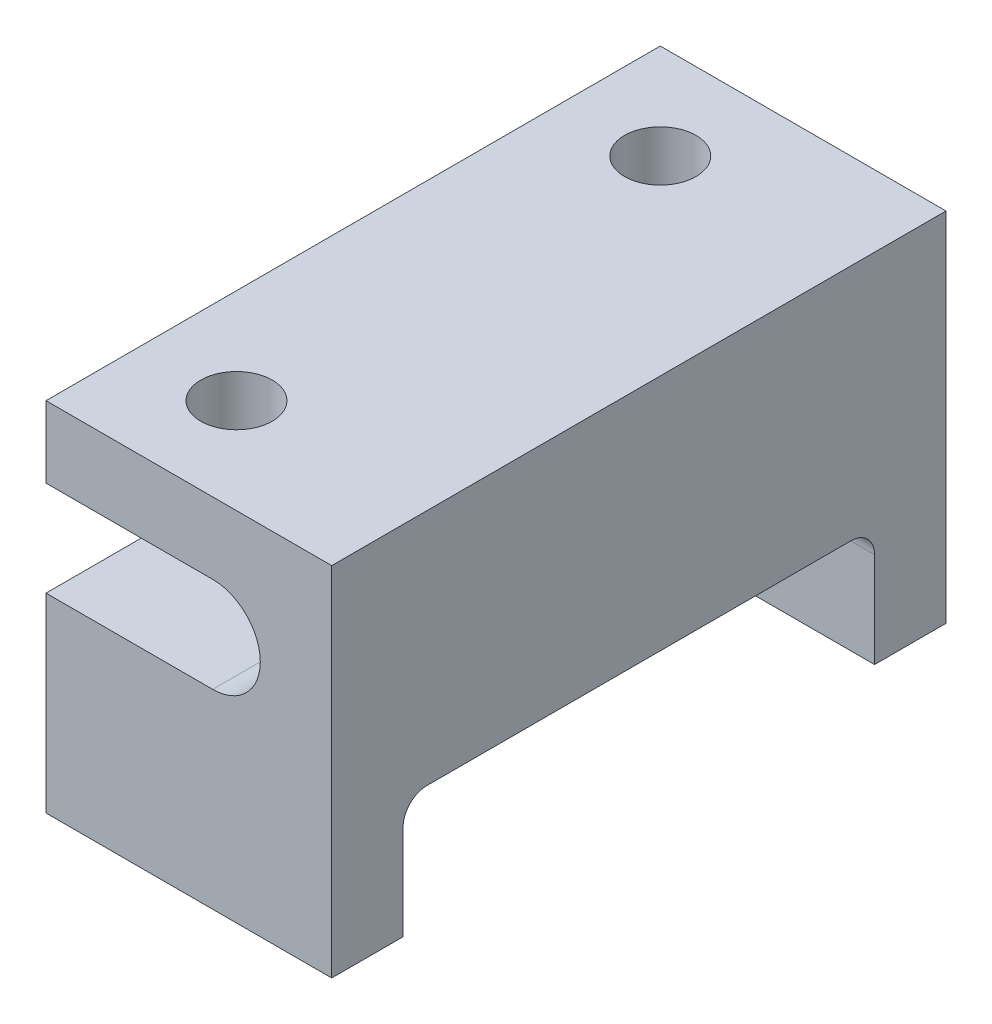
ISO-10303-21;
HEADER;
FILE_DESCRIPTION(('STEP AP214'),'2;1');
FILE_NAME('part.step','',(''),(''),'','','');
FILE_SCHEMA(('AUTOMOTIVE_DESIGN { 1 0 10303 214 1 1 1 1 }'));
ENDSEC;
DATA;
#1=APPLICATION_CONTEXT('core data for automotive mechanical design processes');
#2=APPLICATION_PROTOCOL_DEFINITION('international standard','automotive_design',2000,#1);
#3=PRODUCT_CONTEXT('',#1,'mechanical');
#4=PRODUCT('Part','Part','',(#3));
#5=PRODUCT_RELATED_PRODUCT_CATEGORY('part','',(#4));
#6=PRODUCT_DEFINITION_FORMATION('','',#4);
#7=PRODUCT_DEFINITION_CONTEXT('part definition',#1,'design');
#8=PRODUCT_DEFINITION('design','',#6,#7);
#9=PRODUCT_DEFINITION_SHAPE('','',#8);
#10=(LENGTH_UNIT() NAMED_UNIT(*) SI_UNIT(.MILLI.,.METRE.));
#11=(NAMED_UNIT(*) PLANE_ANGLE_UNIT() SI_UNIT($,.RADIAN.));
#12=(NAMED_UNIT(*) SI_UNIT($,.STERADIAN.) SOLID_ANGLE_UNIT());
#13=UNCERTAINTY_MEASURE_WITH_UNIT(LENGTH_MEASURE(1.E-05),#10,'distance_accuracy_value','');
#14=(GEOMETRIC_REPRESENTATION_CONTEXT(3) GLOBAL_UNCERTAINTY_ASSIGNED_CONTEXT((#13)) GLOBAL_UNIT_ASSIGNED_CONTEXT((#10,
#11,#12)) REPRESENTATION_CONTEXT('',''));
#15=CARTESIAN_POINT('',(0.,0.,0.));
#16=DIRECTION('',(0.,0.,1.));
#17=DIRECTION('',(1.,0.,0.));
#18=AXIS2_PLACEMENT_3D('',#15,#16,#17);
#19=CARTESIAN_POINT('',(0.,-7.,12.9));
#20=DIRECTION('',(0.,1.,0.));
#21=DIRECTION('',(0.,0.,1.));
#22=AXIS2_PLACEMENT_3D('',#19,#20,#21);
#23=PLANE('',#22);
#24=CARTESIAN_POINT('',(4.,-7.,0.));
#25=DIRECTION('',(0.,-1.,0.));
#26=DIRECTION('',(1.,0.,0.));
#27=AXIS2_PLACEMENT_3D('',#24,#25,#26);
#28=CIRCLE('',#27,1.8);
#29=CARTESIAN_POINT('',(5.8,-7.,0.));
#30=VERTEX_POINT('',#29);
#31=EDGE_CURVE('E236',#30,#30,#28,.T.);
#32=ORIENTED_EDGE('',*,*,#31,.F.);
#33=EDGE_LOOP('',(#32));
#34=FACE_BOUND('',#33,.T.);
#35=DIRECTION('',(0.,0.,-1.));
#36=VECTOR('',#35,1.);
#37=CARTESIAN_POINT('',(0.,-7.,12.9));
#38=LINE('',#37,#36);
#39=CARTESIAN_POINT('',(0.,-7.,8.9));
#40=VERTEX_POINT('',#39);
#41=CARTESIAN_POINT('',(0.,-7.,-8.89999999999999));
#42=VERTEX_POINT('',#41);
#43=EDGE_CURVE('E225',#40,#42,#38,.T.);
#44=ORIENTED_EDGE('',*,*,#43,.T.);
#45=DIRECTION('',(1.,0.,0.));
#46=VECTOR('',#45,1.);
#47=CARTESIAN_POINT('',(0.,-7.,-8.9));
#48=LINE('',#47,#46);
#49=CARTESIAN_POINT('',(12.,-7.,-8.89999999999999));
#50=VERTEX_POINT('',#49);
#51=EDGE_CURVE('E255',#42,#50,#48,.T.);
#52=ORIENTED_EDGE('',*,*,#51,.T.);
#53=DIRECTION('',(0.,0.,-1.));
#54=VECTOR('',#53,1.);
#55=CARTESIAN_POINT('',(12.,-7.,12.9));
#56=LINE('',#55,#54);
#57=CARTESIAN_POINT('',(12.,-7.,8.9));
#58=VERTEX_POINT('',#57);
#59=EDGE_CURVE('E222',#58,#50,#56,.T.);
#60=ORIENTED_EDGE('',*,*,#59,.F.);
#61=DIRECTION('',(1.,0.,0.));
#62=VECTOR('',#61,1.);
#63=CARTESIAN_POINT('',(0.,-7.,8.9));
#64=LINE('',#63,#62);
#65=EDGE_CURVE('E249',#58,#40,#64,.F.);
#66=ORIENTED_EDGE('',*,*,#65,.T.);
#67=EDGE_LOOP('',(#44,#52,#60,#66));
#68=FACE_BOUND('',#67,.T.);
#69=ADVANCED_FACE('F33',(#34,#68),#23,.F.);
#70=CARTESIAN_POINT('',(0.,3.,12.9));
#71=DIRECTION('',(1.,0.,0.));
#72=DIRECTION('',(0.,1.,0.));
#73=AXIS2_PLACEMENT_3D('',#70,#71,#72);
#74=PLANE('',#73);
#75=DIRECTION('',(0.,-1.,0.));
#76=VECTOR('',#75,1.);
#77=CARTESIAN_POINT('',(0.,3.,-12.9));
#78=LINE('',#77,#76);
#79=CARTESIAN_POINT('',(0.,3.,-12.9));
#80=VERTEX_POINT('',#79);
#81=CARTESIAN_POINT('',(0.,0.,-12.9));
#82=VERTEX_POINT('',#81);
#83=EDGE_CURVE('E187',#80,#82,#78,.T.);
#84=ORIENTED_EDGE('',*,*,#83,.T.);
#85=DIRECTION('',(0.,0.,-1.));
#86=VECTOR('',#85,1.);
#87=CARTESIAN_POINT('',(0.,0.,12.9));
#88=LINE('',#87,#86);
#89=CARTESIAN_POINT('',(0.,0.,12.9));
#90=VERTEX_POINT('',#89);
#91=EDGE_CURVE('E230',#90,#82,#88,.T.);
#92=ORIENTED_EDGE('',*,*,#91,.F.);
#93=DIRECTION('',(0.,-1.,0.));
#94=VECTOR('',#93,1.);
#95=CARTESIAN_POINT('',(0.,3.,12.9));
#96=LINE('',#95,#94);
#97=CARTESIAN_POINT('',(0.,3.,12.9));
#98=VERTEX_POINT('',#97);
#99=EDGE_CURVE('E190',#98,#90,#96,.T.);
#100=ORIENTED_EDGE('',*,*,#99,.F.);
#101=DIRECTION('',(0.,0.,-1.));
#102=VECTOR('',#101,1.);
#103=CARTESIAN_POINT('',(0.,3.,12.9));
#104=LINE('',#103,#102);
#105=EDGE_CURVE('E205',#98,#80,#104,.T.);
#106=ORIENTED_EDGE('',*,*,#105,.T.);
#107=EDGE_LOOP('',(#84,#92,#100,#106));
#108=FACE_BOUND('',#107,.T.);
#109=ADVANCED_FACE('F306',(#108),#74,.F.);
#110=CARTESIAN_POINT('',(0.,0.,12.9));
#111=DIRECTION('',(0.,1.,0.));
#112=DIRECTION('',(0.,0.,1.));
#113=AXIS2_PLACEMENT_3D('',#110,#111,#112);
#114=PLANE('',#113);
#115=CARTESIAN_POINT('',(4.,0.,8.9));
#116=DIRECTION('',(0.,1.,0.));
#117=DIRECTION('',(-1.,0.,0.));
#118=AXIS2_PLACEMENT_3D('',#115,#116,#117);
#119=CIRCLE('',#118,1.5);
#120=CARTESIAN_POINT('',(2.5,0.,8.9));
#121=VERTEX_POINT('',#120);
#122=EDGE_CURVE('E253',#121,#121,#119,.T.);
#123=ORIENTED_EDGE('',*,*,#122,.T.);
#124=EDGE_LOOP('',(#123));
#125=FACE_BOUND('',#124,.T.);
#126=CARTESIAN_POINT('',(4.,0.,-8.9));
#127=DIRECTION('',(0.,1.,0.));
#128=DIRECTION('',(-1.,0.,0.));
#129=AXIS2_PLACEMENT_3D('',#126,#127,#128);
#130=CIRCLE('',#129,1.5);
#131=CARTESIAN_POINT('',(2.5,0.,-8.9));
#132=VERTEX_POINT('',#131);
#133=EDGE_CURVE('E378',#132,#132,#130,.T.);
#134=ORIENTED_EDGE('',*,*,#133,.T.);
#135=EDGE_LOOP('',(#134));
#136=FACE_BOUND('',#135,.T.);
#137=DIRECTION('',(1.,0.,0.));
#138=VECTOR('',#137,1.);
#139=CARTESIAN_POINT('',(0.,0.,-12.9));
#140=LINE('',#139,#138);
#141=CARTESIAN_POINT('',(7.,0.,-12.9));
#142=VERTEX_POINT('',#141);
#143=EDGE_CURVE('E208',#82,#142,#140,.T.);
#144=ORIENTED_EDGE('',*,*,#143,.T.);
#145=DIRECTION('',(0.,0.,-1.));
#146=VECTOR('',#145,1.);
#147=CARTESIAN_POINT('',(7.,0.,12.9));
#148=LINE('',#147,#146);
#149=CARTESIAN_POINT('',(7.,0.,12.9));
#150=VERTEX_POINT('',#149);
#151=EDGE_CURVE('E239',#142,#150,#148,.F.);
#152=ORIENTED_EDGE('',*,*,#151,.T.);
#153=DIRECTION('',(1.,0.,0.));
#154=VECTOR('',#153,1.);
#155=CARTESIAN_POINT('',(0.,0.,12.9));
#156=LINE('',#155,#154);
#157=EDGE_CURVE('E193',#90,#150,#156,.T.);
#158=ORIENTED_EDGE('',*,*,#157,.F.);
#159=ORIENTED_EDGE('',*,*,#91,.T.);
#160=EDGE_LOOP('',(#144,#152,#158,#159));
#161=FACE_BOUND('',#160,.T.);
#162=ADVANCED_FACE('F312',(#125,#136,#161),#114,.F.);
#163=CARTESIAN_POINT('',(9.,-4.,12.9));
#164=DIRECTION('',(0.,-1.,0.));
#165=DIRECTION('',(1.,0.,0.));
#166=AXIS2_PLACEMENT_3D('',#163,#164,#165);
#167=PLANE('',#166);
#168=CARTESIAN_POINT('',(4.,-4.,0.));
#169=DIRECTION('',(0.,-1.,0.));
#170=DIRECTION('',(1.,0.,0.));
#171=AXIS2_PLACEMENT_3D('',#168,#169,#170);
#172=CIRCLE('',#171,1.8);
#173=CARTESIAN_POINT('',(5.8,-4.,0.));
#174=VERTEX_POINT('',#173);
#175=EDGE_CURVE('E170',#174,#174,#172,.T.);
#176=ORIENTED_EDGE('',*,*,#175,.T.);
#177=EDGE_LOOP('',(#176));
#178=FACE_BOUND('',#177,.T.);
#179=DIRECTION('',(-1.,0.,0.));
#180=VECTOR('',#179,1.);
#181=CARTESIAN_POINT('',(9.,-4.,12.9));
#182=LINE('',#181,#180);
#183=CARTESIAN_POINT('',(7.,-4.,12.9));
#184=VERTEX_POINT('',#183);
#185=CARTESIAN_POINT('',(0.,-4.,12.9));
#186=VERTEX_POINT('',#185);
#187=EDGE_CURVE('E197',#184,#186,#182,.T.);
#188=ORIENTED_EDGE('',*,*,#187,.F.);
#189=DIRECTION('',(0.,0.,-1.));
#190=VECTOR('',#189,1.);
#191=CARTESIAN_POINT('',(7.,-4.,-12.9));
#192=LINE('',#191,#190);
#193=CARTESIAN_POINT('',(7.,-4.,-12.9));
#194=VERTEX_POINT('',#193);
#195=EDGE_CURVE('E233',#184,#194,#192,.T.);
#196=ORIENTED_EDGE('',*,*,#195,.T.);
#197=DIRECTION('',(-1.,0.,0.));
#198=VECTOR('',#197,1.);
#199=CARTESIAN_POINT('',(9.,-4.,-12.9));
#200=LINE('',#199,#198);
#201=CARTESIAN_POINT('',(0.,-4.,-12.9));
#202=VERTEX_POINT('',#201);
#203=EDGE_CURVE('E211',#194,#202,#200,.T.);
#204=ORIENTED_EDGE('',*,*,#203,.T.);
#205=DIRECTION('',(0.,0.,-1.));
#206=VECTOR('',#205,1.);
#207=CARTESIAN_POINT('',(0.,-4.,12.9));
#208=LINE('',#207,#206);
#209=EDGE_CURVE('E228',#186,#202,#208,.T.);
#210=ORIENTED_EDGE('',*,*,#209,.F.);
#211=EDGE_LOOP('',(#188,#196,#204,#210));
#212=FACE_BOUND('',#211,.T.);
#213=ADVANCED_FACE('F286',(#178,#212),#167,.F.);
#214=CARTESIAN_POINT('',(0.,-4.,12.9));
#215=DIRECTION('',(1.,0.,0.));
#216=DIRECTION('',(0.,1.,0.));
#217=AXIS2_PLACEMENT_3D('',#214,#215,#216);
#218=PLANE('',#217);
#219=DIRECTION('',(0.,-1.,0.));
#220=VECTOR('',#219,1.);
#221=CARTESIAN_POINT('',(0.,-4.,-12.9));
#222=LINE('',#221,#220);
#223=CARTESIAN_POINT('',(0.,-12.,-12.9));
#224=VERTEX_POINT('',#223);
#225=EDGE_CURVE('E163',#202,#224,#222,.T.);
#226=ORIENTED_EDGE('',*,*,#225,.T.);
#227=DIRECTION('',(0.,0.,-1.));
#228=VECTOR('',#227,1.);
#229=CARTESIAN_POINT('',(0.,-12.,-12.9));
#230=LINE('',#229,#228);
#231=CARTESIAN_POINT('',(0.,-12.,-9.9));
#232=VERTEX_POINT('',#231);
#233=EDGE_CURVE('E150',#232,#224,#230,.T.);
#234=ORIENTED_EDGE('',*,*,#233,.F.);
#235=DIRECTION('',(0.,-1.,0.));
#236=VECTOR('',#235,1.);
#237=CARTESIAN_POINT('',(0.,-12.,-9.9));
#238=LINE('',#237,#236);
#239=CARTESIAN_POINT('',(0.,-8.,-9.9));
#240=VERTEX_POINT('',#239);
#241=EDGE_CURVE('E140',#240,#232,#238,.T.);
#242=ORIENTED_EDGE('',*,*,#241,.F.);
#243=CARTESIAN_POINT('',(0.,-8.,-8.9));
#244=DIRECTION('',(1.,0.,0.));
#245=DIRECTION('',(0.,1.,0.));
#246=AXIS2_PLACEMENT_3D('',#243,#244,#245);
#247=CIRCLE('',#246,1.);
#248=EDGE_CURVE('E263',#240,#42,#247,.T.);
#249=ORIENTED_EDGE('',*,*,#248,.T.);
#250=ORIENTED_EDGE('',*,*,#43,.F.);
#251=CARTESIAN_POINT('',(0.,-8.,8.9));
#252=DIRECTION('',(1.,0.,0.));
#253=DIRECTION('',(0.,1.,0.));
#254=AXIS2_PLACEMENT_3D('',#251,#252,#253);
#255=CIRCLE('',#254,1.);
#256=CARTESIAN_POINT('',(0.,-8.,9.9));
#257=VERTEX_POINT('',#256);
#258=EDGE_CURVE('E11',#40,#257,#255,.T.);
#259=ORIENTED_EDGE('',*,*,#258,.T.);
#260=DIRECTION('',(0.,1.,0.));
#261=VECTOR('',#260,1.);
#262=CARTESIAN_POINT('',(0.,-12.,9.9));
#263=LINE('',#262,#261);
#264=CARTESIAN_POINT('',(0.,-12.,9.9));
#265=VERTEX_POINT('',#264);
#266=EDGE_CURVE('E177',#265,#257,#263,.T.);
#267=ORIENTED_EDGE('',*,*,#266,.F.);
#268=DIRECTION('',(0.,0.,-1.));
#269=VECTOR('',#268,1.);
#270=CARTESIAN_POINT('',(0.,-12.,12.9));
#271=LINE('',#270,#269);
#272=CARTESIAN_POINT('',(0.,-12.,12.9));
#273=VERTEX_POINT('',#272);
#274=EDGE_CURVE('E174',#273,#265,#271,.T.);
#275=ORIENTED_EDGE('',*,*,#274,.F.);
#276=DIRECTION('',(0.,-1.,0.));
#277=VECTOR('',#276,1.);
#278=CARTESIAN_POINT('',(0.,-4.,12.9));
#279=LINE('',#278,#277);
#280=EDGE_CURVE('E199',#186,#273,#279,.T.);
#281=ORIENTED_EDGE('',*,*,#280,.F.);
#282=ORIENTED_EDGE('',*,*,#209,.T.);
#283=EDGE_LOOP('',(#226,#234,#242,#249,#250,#259,#267,#275,#281,#282));
#284=FACE_BOUND('',#283,.T.);
#285=ADVANCED_FACE('F160',(#284),#218,.F.);
#286=CARTESIAN_POINT('',(12.,-7.,12.9));
#287=DIRECTION('',(-1.,0.,0.));
#288=DIRECTION('',(0.,-1.,0.));
#289=AXIS2_PLACEMENT_3D('',#286,#287,#288);
#290=PLANE('',#289);
#291=DIRECTION('',(0.,1.,0.));
#292=VECTOR('',#291,1.);
#293=CARTESIAN_POINT('',(12.,-7.,-12.9));
#294=LINE('',#293,#292);
#295=CARTESIAN_POINT('',(12.,-12.,-12.9));
#296=VERTEX_POINT('',#295);
#297=CARTESIAN_POINT('',(12.,3.,-12.9));
#298=VERTEX_POINT('',#297);
#299=EDGE_CURVE('E214',#296,#298,#294,.T.);
#300=ORIENTED_EDGE('',*,*,#299,.T.);
#301=DIRECTION('',(0.,0.,-1.));
#302=VECTOR('',#301,1.);
#303=CARTESIAN_POINT('',(12.,3.,12.9));
#304=LINE('',#303,#302);
#305=CARTESIAN_POINT('',(12.,3.,12.9));
#306=VERTEX_POINT('',#305);
#307=EDGE_CURVE('E219',#306,#298,#304,.T.);
#308=ORIENTED_EDGE('',*,*,#307,.F.);
#309=DIRECTION('',(0.,1.,0.));
#310=VECTOR('',#309,1.);
#311=CARTESIAN_POINT('',(12.,-7.,12.9));
#312=LINE('',#311,#310);
#313=CARTESIAN_POINT('',(12.,-12.,12.9));
#314=VERTEX_POINT('',#313);
#315=EDGE_CURVE('E201',#314,#306,#312,.T.);
#316=ORIENTED_EDGE('',*,*,#315,.F.);
#317=DIRECTION('',(0.,0.,-1.));
#318=VECTOR('',#317,1.);
#319=CARTESIAN_POINT('',(12.,-12.,12.9));
#320=LINE('',#319,#318);
#321=CARTESIAN_POINT('',(12.,-12.,9.9));
#322=VERTEX_POINT('',#321);
#323=EDGE_CURVE('E172',#314,#322,#320,.T.);
#324=ORIENTED_EDGE('',*,*,#323,.T.);
#325=DIRECTION('',(0.,1.,0.));
#326=VECTOR('',#325,1.);
#327=CARTESIAN_POINT('',(12.,-12.,9.9));
#328=LINE('',#327,#326);
#329=CARTESIAN_POINT('',(12.,-8.,9.9));
#330=VERTEX_POINT('',#329);
#331=EDGE_CURVE('E178',#322,#330,#328,.T.);
#332=ORIENTED_EDGE('',*,*,#331,.T.);
#333=CARTESIAN_POINT('',(12.,-8.,8.9));
#334=DIRECTION('',(-1.,0.,0.));
#335=DIRECTION('',(0.,-1.,0.));
#336=AXIS2_PLACEMENT_3D('',#333,#334,#335);
#337=CIRCLE('',#336,1.);
#338=EDGE_CURVE('E41',#330,#58,#337,.T.);
#339=ORIENTED_EDGE('',*,*,#338,.T.);
#340=ORIENTED_EDGE('',*,*,#59,.T.);
#341=CARTESIAN_POINT('',(12.,-8.,-8.9));
#342=DIRECTION('',(-1.,0.,0.));
#343=DIRECTION('',(0.,-1.,0.));
#344=AXIS2_PLACEMENT_3D('',#341,#342,#343);
#345=CIRCLE('',#344,1.);
#346=CARTESIAN_POINT('',(12.,-8.,-9.9));
#347=VERTEX_POINT('',#346);
#348=EDGE_CURVE('E261',#50,#347,#345,.T.);
#349=ORIENTED_EDGE('',*,*,#348,.T.);
#350=DIRECTION('',(0.,-1.,0.));
#351=VECTOR('',#350,1.);
#352=CARTESIAN_POINT('',(12.,-12.,-9.9));
#353=LINE('',#352,#351);
#354=CARTESIAN_POINT('',(12.,-12.,-9.9));
#355=VERTEX_POINT('',#354);
#356=EDGE_CURVE('E168',#347,#355,#353,.T.);
#357=ORIENTED_EDGE('',*,*,#356,.T.);
#358=DIRECTION('',(0.,0.,-1.));
#359=VECTOR('',#358,1.);
#360=CARTESIAN_POINT('',(12.,-12.,-12.9));
#361=LINE('',#360,#359);
#362=EDGE_CURVE('E151',#355,#296,#361,.T.);
#363=ORIENTED_EDGE('',*,*,#362,.T.);
#364=EDGE_LOOP('',(#300,#308,#316,#324,#332,#339,#340,#349,#357,#363));
#365=FACE_BOUND('',#364,.T.);
#366=ADVANCED_FACE('F266',(#365),#290,.F.);
#367=CARTESIAN_POINT('',(12.,3.,12.9));
#368=DIRECTION('',(0.,-1.,0.));
#369=DIRECTION('',(1.,0.,0.));
#370=AXIS2_PLACEMENT_3D('',#367,#368,#369);
#371=PLANE('',#370);
#372=CARTESIAN_POINT('',(4.,3.,8.9));
#373=DIRECTION('',(0.,1.,0.));
#374=DIRECTION('',(-1.,0.,0.));
#375=AXIS2_PLACEMENT_3D('',#372,#373,#374);
#376=CIRCLE('',#375,1.5);
#377=CARTESIAN_POINT('',(2.5,3.,8.9));
#378=VERTEX_POINT('',#377);
#379=EDGE_CURVE('E377',#378,#378,#376,.T.);
#380=ORIENTED_EDGE('',*,*,#379,.F.);
#381=EDGE_LOOP('',(#380));
#382=FACE_BOUND('',#381,.T.);
#383=CARTESIAN_POINT('',(4.,3.,-8.9));
#384=DIRECTION('',(0.,1.,0.));
#385=DIRECTION('',(-1.,0.,0.));
#386=AXIS2_PLACEMENT_3D('',#383,#384,#385);
#387=CIRCLE('',#386,1.5);
#388=CARTESIAN_POINT('',(2.5,3.,-8.9));
#389=VERTEX_POINT('',#388);
#390=EDGE_CURVE('E382',#389,#389,#387,.T.);
#391=ORIENTED_EDGE('',*,*,#390,.F.);
#392=EDGE_LOOP('',(#391));
#393=FACE_BOUND('',#392,.T.);
#394=DIRECTION('',(-1.,0.,0.));
#395=VECTOR('',#394,1.);
#396=CARTESIAN_POINT('',(12.,3.,-12.9));
#397=LINE('',#396,#395);
#398=EDGE_CURVE('E194',#298,#80,#397,.T.);
#399=ORIENTED_EDGE('',*,*,#398,.T.);
#400=ORIENTED_EDGE('',*,*,#105,.F.);
#401=DIRECTION('',(-1.,0.,0.));
#402=VECTOR('',#401,1.);
#403=CARTESIAN_POINT('',(12.,3.,12.9));
#404=LINE('',#403,#402);
#405=EDGE_CURVE('E203',#306,#98,#404,.T.);
#406=ORIENTED_EDGE('',*,*,#405,.F.);
#407=ORIENTED_EDGE('',*,*,#307,.T.);
#408=EDGE_LOOP('',(#399,#400,#406,#407));
#409=FACE_BOUND('',#408,.T.);
#410=ADVANCED_FACE('F343',(#382,#393,#409),#371,.F.);
#411=CARTESIAN_POINT('',(0.,0.,12.9));
#412=DIRECTION('',(0.,0.,1.));
#413=DIRECTION('',(1.,0.,0.));
#414=AXIS2_PLACEMENT_3D('',#411,#412,#413);
#415=PLANE('',#414);
#416=ORIENTED_EDGE('',*,*,#99,.T.);
#417=ORIENTED_EDGE('',*,*,#157,.T.);
#418=CARTESIAN_POINT('',(7.,-2.,12.9));
#419=DIRECTION('',(0.,0.,1.));
#420=DIRECTION('',(1.,0.,0.));
#421=AXIS2_PLACEMENT_3D('',#418,#419,#420);
#422=CIRCLE('',#421,2.);
#423=CARTESIAN_POINT('',(9.,-2.,12.9));
#424=VERTEX_POINT('',#423);
#425=EDGE_CURVE('E247',#150,#424,#422,.F.);
#426=ORIENTED_EDGE('',*,*,#425,.T.);
#427=CARTESIAN_POINT('',(7.,-2.,12.9));
#428=DIRECTION('',(0.,0.,1.));
#429=DIRECTION('',(1.,0.,0.));
#430=AXIS2_PLACEMENT_3D('',#427,#428,#429);
#431=CIRCLE('',#430,2.);
#432=EDGE_CURVE('E243',#424,#184,#431,.F.);
#433=ORIENTED_EDGE('',*,*,#432,.T.);
#434=ORIENTED_EDGE('',*,*,#187,.T.);
#435=ORIENTED_EDGE('',*,*,#280,.T.);
#436=DIRECTION('',(1.,0.,0.));
#437=VECTOR('',#436,1.);
#438=CARTESIAN_POINT('',(0.,-12.,12.9));
#439=LINE('',#438,#437);
#440=EDGE_CURVE('E180',#273,#314,#439,.T.);
#441=ORIENTED_EDGE('',*,*,#440,.T.);
#442=ORIENTED_EDGE('',*,*,#315,.T.);
#443=ORIENTED_EDGE('',*,*,#405,.T.);
#444=EDGE_LOOP('',(#416,#417,#426,#433,#434,#435,#441,#442,#443));
#445=FACE_BOUND('',#444,.T.);
#446=ADVANCED_FACE('F279',(#445),#415,.T.);
#447=CARTESIAN_POINT('',(0.,0.,-12.9));
#448=DIRECTION('',(0.,0.,1.));
#449=DIRECTION('',(1.,0.,0.));
#450=AXIS2_PLACEMENT_3D('',#447,#448,#449);
#451=PLANE('',#450);
#452=ORIENTED_EDGE('',*,*,#83,.F.);
#453=ORIENTED_EDGE('',*,*,#398,.F.);
#454=ORIENTED_EDGE('',*,*,#299,.F.);
#455=DIRECTION('',(1.,0.,0.));
#456=VECTOR('',#455,1.);
#457=CARTESIAN_POINT('',(0.,-12.,-12.9));
#458=LINE('',#457,#456);
#459=EDGE_CURVE('E158',#224,#296,#458,.T.);
#460=ORIENTED_EDGE('',*,*,#459,.F.);
#461=ORIENTED_EDGE('',*,*,#225,.F.);
#462=ORIENTED_EDGE('',*,*,#203,.F.);
#463=CARTESIAN_POINT('',(7.,-2.,-12.9));
#464=DIRECTION('',(0.,0.,1.));
#465=DIRECTION('',(1.,0.,0.));
#466=AXIS2_PLACEMENT_3D('',#463,#464,#465);
#467=CIRCLE('',#466,2.);
#468=CARTESIAN_POINT('',(9.,-2.,-12.9));
#469=VERTEX_POINT('',#468);
#470=EDGE_CURVE('E241',#194,#469,#467,.T.);
#471=ORIENTED_EDGE('',*,*,#470,.T.);
#472=CARTESIAN_POINT('',(7.,-2.,-12.9));
#473=DIRECTION('',(0.,0.,1.));
#474=DIRECTION('',(1.,0.,0.));
#475=AXIS2_PLACEMENT_3D('',#472,#473,#474);
#476=CIRCLE('',#475,2.);
#477=EDGE_CURVE('E245',#469,#142,#476,.T.);
#478=ORIENTED_EDGE('',*,*,#477,.T.);
#479=ORIENTED_EDGE('',*,*,#143,.F.);
#480=EDGE_LOOP('',(#452,#453,#454,#460,#461,#462,#471,#478,#479));
#481=FACE_BOUND('',#480,.T.);
#482=ADVANCED_FACE('F290',(#481),#451,.F.);
#483=CARTESIAN_POINT('',(0.,-12.,9.9));
#484=DIRECTION('',(0.,0.,-1.));
#485=DIRECTION('',(-1.,0.,0.));
#486=AXIS2_PLACEMENT_3D('',#483,#484,#485);
#487=PLANE('',#486);
#488=ORIENTED_EDGE('',*,*,#266,.T.);
#489=DIRECTION('',(1.,0.,0.));
#490=VECTOR('',#489,1.);
#491=CARTESIAN_POINT('',(0.,-8.,9.9));
#492=LINE('',#491,#490);
#493=EDGE_CURVE('E259',#257,#330,#492,.T.);
#494=ORIENTED_EDGE('',*,*,#493,.T.);
#495=ORIENTED_EDGE('',*,*,#331,.F.);
#496=DIRECTION('',(1.,0.,0.));
#497=VECTOR('',#496,1.);
#498=CARTESIAN_POINT('',(0.,-12.,9.9));
#499=LINE('',#498,#497);
#500=EDGE_CURVE('E185',#265,#322,#499,.T.);
#501=ORIENTED_EDGE('',*,*,#500,.F.);
#502=EDGE_LOOP('',(#488,#494,#495,#501));
#503=FACE_BOUND('',#502,.T.);
#504=ADVANCED_FACE('F271',(#503),#487,.T.);
#505=CARTESIAN_POINT('',(0.,-12.,12.9));
#506=DIRECTION('',(0.,-1.,0.));
#507=DIRECTION('',(0.,0.,-1.));
#508=AXIS2_PLACEMENT_3D('',#505,#506,#507);
#509=PLANE('',#508);
#510=ORIENTED_EDGE('',*,*,#323,.F.);
#511=ORIENTED_EDGE('',*,*,#440,.F.);
#512=ORIENTED_EDGE('',*,*,#274,.T.);
#513=ORIENTED_EDGE('',*,*,#500,.T.);
#514=EDGE_LOOP('',(#510,#511,#512,#513));
#515=FACE_BOUND('',#514,.T.);
#516=ADVANCED_FACE('F277',(#515),#509,.T.);
#517=CARTESIAN_POINT('',(0.,-12.,-12.9));
#518=DIRECTION('',(0.,-1.,0.));
#519=DIRECTION('',(0.,0.,-1.));
#520=AXIS2_PLACEMENT_3D('',#517,#518,#519);
#521=PLANE('',#520);
#522=ORIENTED_EDGE('',*,*,#362,.F.);
#523=DIRECTION('',(1.,0.,0.));
#524=VECTOR('',#523,1.);
#525=CARTESIAN_POINT('',(0.,-12.,-9.9));
#526=LINE('',#525,#524);
#527=EDGE_CURVE('E144',#232,#355,#526,.T.);
#528=ORIENTED_EDGE('',*,*,#527,.F.);
#529=ORIENTED_EDGE('',*,*,#233,.T.);
#530=ORIENTED_EDGE('',*,*,#459,.T.);
#531=EDGE_LOOP('',(#522,#528,#529,#530));
#532=FACE_BOUND('',#531,.T.);
#533=ADVANCED_FACE('F155',(#532),#521,.T.);
#534=CARTESIAN_POINT('',(0.,-12.,-9.9));
#535=DIRECTION('',(0.,0.,1.));
#536=DIRECTION('',(0.,-1.,0.));
#537=AXIS2_PLACEMENT_3D('',#534,#535,#536);
#538=PLANE('',#537);
#539=ORIENTED_EDGE('',*,*,#356,.F.);
#540=DIRECTION('',(1.,0.,0.));
#541=VECTOR('',#540,1.);
#542=CARTESIAN_POINT('',(0.,-8.,-9.9));
#543=LINE('',#542,#541);
#544=EDGE_CURVE('E147',#347,#240,#543,.F.);
#545=ORIENTED_EDGE('',*,*,#544,.T.);
#546=ORIENTED_EDGE('',*,*,#241,.T.);
#547=ORIENTED_EDGE('',*,*,#527,.T.);
#548=EDGE_LOOP('',(#539,#545,#546,#547));
#549=FACE_BOUND('',#548,.T.);
#550=ADVANCED_FACE('F143',(#549),#538,.T.);
#551=CARTESIAN_POINT('',(4.,-2.,0.));
#552=DIRECTION('',(0.,-1.,0.));
#553=DIRECTION('',(1.,0.,0.));
#554=AXIS2_PLACEMENT_3D('',#551,#552,#553);
#555=CYLINDRICAL_SURFACE('',#554,1.8);
#556=ORIENTED_EDGE('',*,*,#31,.T.);
#557=EDGE_LOOP('',(#556));
#558=FACE_BOUND('',#557,.T.);
#559=ORIENTED_EDGE('',*,*,#175,.F.);
#560=EDGE_LOOP('',(#559));
#561=FACE_BOUND('',#560,.T.);
#562=ADVANCED_FACE('F327',(#558,#561),#555,.F.);
#563=CARTESIAN_POINT('',(7.,-2.,12.9));
#564=DIRECTION('',(0.,0.,1.));
#565=DIRECTION('',(1.,0.,0.));
#566=AXIS2_PLACEMENT_3D('',#563,#564,#565);
#567=CYLINDRICAL_SURFACE('',#566,2.);
#568=DIRECTION('',(0.,0.,-1.));
#569=VECTOR('',#568,1.);
#570=CARTESIAN_POINT('',(9.,-2.,-12.9));
#571=LINE('',#570,#569);
#572=EDGE_CURVE('E250',#424,#469,#571,.T.);
#573=ORIENTED_EDGE('',*,*,#572,.F.);
#574=ORIENTED_EDGE('',*,*,#425,.F.);
#575=ORIENTED_EDGE('',*,*,#151,.F.);
#576=ORIENTED_EDGE('',*,*,#477,.F.);
#577=EDGE_LOOP('',(#573,#574,#575,#576));
#578=FACE_BOUND('',#577,.T.);
#579=ADVANCED_FACE('F301',(#578),#567,.F.);
#580=CARTESIAN_POINT('',(7.,-2.,12.9));
#581=DIRECTION('',(0.,0.,1.));
#582=DIRECTION('',(1.,0.,0.));
#583=AXIS2_PLACEMENT_3D('',#580,#581,#582);
#584=CYLINDRICAL_SURFACE('',#583,2.);
#585=ORIENTED_EDGE('',*,*,#432,.F.);
#586=ORIENTED_EDGE('',*,*,#572,.T.);
#587=ORIENTED_EDGE('',*,*,#470,.F.);
#588=ORIENTED_EDGE('',*,*,#195,.F.);
#589=EDGE_LOOP('',(#585,#586,#587,#588));
#590=FACE_BOUND('',#589,.T.);
#591=ADVANCED_FACE('F295',(#590),#584,.F.);
#592=CARTESIAN_POINT('',(0.,-8.,-8.9));
#593=DIRECTION('',(1.,0.,0.));
#594=DIRECTION('',(0.,0.,-1.));
#595=AXIS2_PLACEMENT_3D('',#592,#593,#594);
#596=CYLINDRICAL_SURFACE('',#595,1.);
#597=ORIENTED_EDGE('',*,*,#248,.F.);
#598=ORIENTED_EDGE('',*,*,#544,.F.);
#599=ORIENTED_EDGE('',*,*,#348,.F.);
#600=ORIENTED_EDGE('',*,*,#51,.F.);
#601=EDGE_LOOP('',(#597,#598,#599,#600));
#602=FACE_BOUND('',#601,.T.);
#603=ADVANCED_FACE('F293',(#602),#596,.F.);
#604=CARTESIAN_POINT('',(0.,-8.,8.9));
#605=DIRECTION('',(1.,0.,0.));
#606=DIRECTION('',(0.,0.,-1.));
#607=AXIS2_PLACEMENT_3D('',#604,#605,#606);
#608=CYLINDRICAL_SURFACE('',#607,1.);
#609=ORIENTED_EDGE('',*,*,#258,.F.);
#610=ORIENTED_EDGE('',*,*,#65,.F.);
#611=ORIENTED_EDGE('',*,*,#338,.F.);
#612=ORIENTED_EDGE('',*,*,#493,.F.);
#613=EDGE_LOOP('',(#609,#610,#611,#612));
#614=FACE_BOUND('',#613,.T.);
#615=ADVANCED_FACE('F35',(#614),#608,.F.);
#616=CARTESIAN_POINT('',(4.,0.,-8.9));
#617=DIRECTION('',(0.,1.,0.));
#618=DIRECTION('',(-1.,0.,0.));
#619=AXIS2_PLACEMENT_3D('',#616,#617,#618);
#620=CYLINDRICAL_SURFACE('',#619,1.5);
#621=ORIENTED_EDGE('',*,*,#133,.F.);
#622=EDGE_LOOP('',(#621));
#623=FACE_BOUND('',#622,.T.);
#624=ORIENTED_EDGE('',*,*,#390,.T.);
#625=EDGE_LOOP('',(#624));
#626=FACE_BOUND('',#625,.T.);
#627=ADVANCED_FACE('F300',(#623,#626),#620,.F.);
#628=CARTESIAN_POINT('',(4.,0.,8.9));
#629=DIRECTION('',(0.,1.,0.));
#630=DIRECTION('',(-1.,0.,0.));
#631=AXIS2_PLACEMENT_3D('',#628,#629,#630);
#632=CYLINDRICAL_SURFACE('',#631,1.5);
#633=ORIENTED_EDGE('',*,*,#122,.F.);
#634=EDGE_LOOP('',(#633));
#635=FACE_BOUND('',#634,.T.);
#636=ORIENTED_EDGE('',*,*,#379,.T.);
#637=EDGE_LOOP('',(#636));
#638=FACE_BOUND('',#637,.T.);
#639=ADVANCED_FACE('F367',(#635,#638),#632,.F.);
#640=CLOSED_SHELL('',(#69,#109,#162,#213,#285,#366,#410,#446,#482,#504,#516,#533,#550,#562,#579,
#591,#603,#615,#627,#639));
#641=MANIFOLD_SOLID_BREP('B2',#640);
#642=ADVANCED_BREP_SHAPE_REPRESENTATION('',(#18,#641),#14);
#643=SHAPE_DEFINITION_REPRESENTATION(#9,#642);
ENDSEC;
END-ISO-10303-21;
